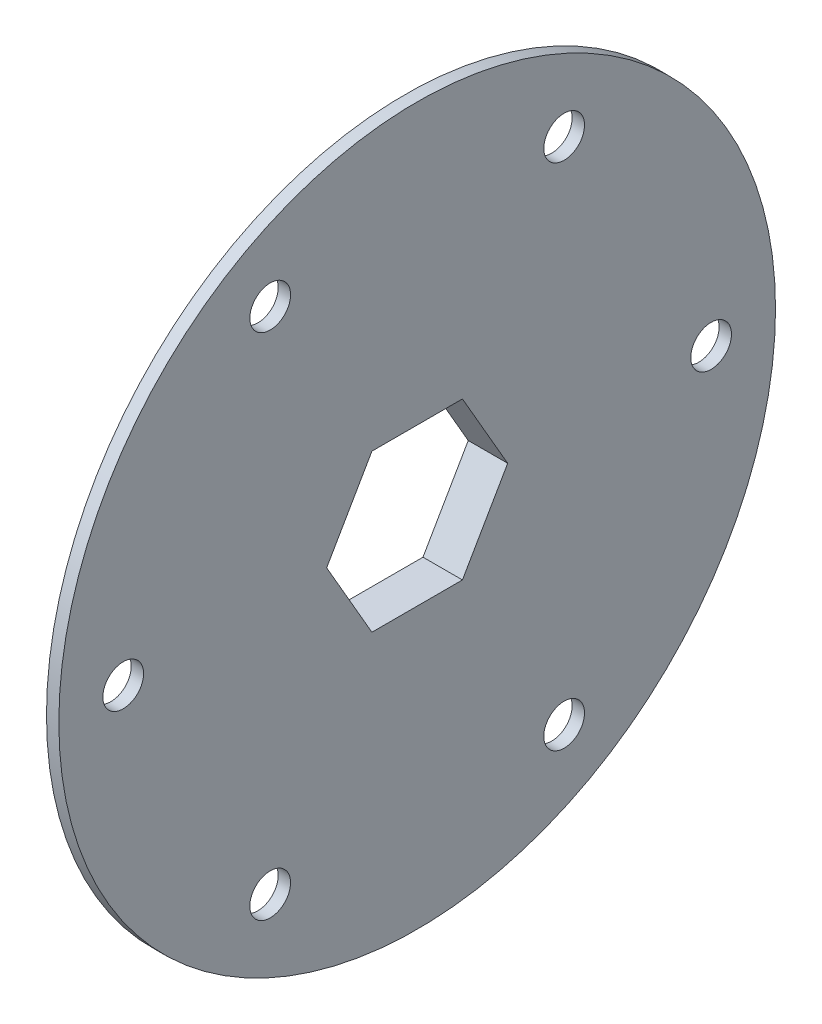
ISO-10303-21;
HEADER;
FILE_DESCRIPTION(('STEP AP214'),'2;1');
FILE_NAME('part.step','',(''),(''),'','','');
FILE_SCHEMA(('AUTOMOTIVE_DESIGN { 1 0 10303 214 1 1 1 1 }'));
ENDSEC;
DATA;
#1=APPLICATION_CONTEXT('core data for automotive mechanical design processes');
#2=APPLICATION_PROTOCOL_DEFINITION('international standard','automotive_design',2000,#1);
#3=PRODUCT_CONTEXT('',#1,'mechanical');
#4=PRODUCT('Part','Part','',(#3));
#5=PRODUCT_RELATED_PRODUCT_CATEGORY('part','',(#4));
#6=PRODUCT_DEFINITION_FORMATION('','',#4);
#7=PRODUCT_DEFINITION_CONTEXT('part definition',#1,'design');
#8=PRODUCT_DEFINITION('design','',#6,#7);
#9=PRODUCT_DEFINITION_SHAPE('','',#8);
#10=(LENGTH_UNIT() NAMED_UNIT(*) SI_UNIT(.MILLI.,.METRE.));
#11=(NAMED_UNIT(*) PLANE_ANGLE_UNIT() SI_UNIT($,.RADIAN.));
#12=(NAMED_UNIT(*) SI_UNIT($,.STERADIAN.) SOLID_ANGLE_UNIT());
#13=UNCERTAINTY_MEASURE_WITH_UNIT(LENGTH_MEASURE(1.E-05),#10,'distance_accuracy_value','');
#14=(GEOMETRIC_REPRESENTATION_CONTEXT(3) GLOBAL_UNCERTAINTY_ASSIGNED_CONTEXT((#13)) GLOBAL_UNIT_ASSIGNED_CONTEXT((#10,
#11,#12)) REPRESENTATION_CONTEXT('',''));
#15=CARTESIAN_POINT('',(0.,0.,0.));
#16=DIRECTION('',(0.,0.,1.));
#17=DIRECTION('',(1.,0.,0.));
#18=AXIS2_PLACEMENT_3D('',#15,#16,#17);
#19=CARTESIAN_POINT('',(1.,3.175,-5.49926131403118));
#20=DIRECTION('',(0.,-0.5,0.866025403784438));
#21=DIRECTION('',(0.,-0.866025403784438,-0.5));
#22=AXIS2_PLACEMENT_3D('',#19,#20,#21);
#23=PLANE('',#22);
#24=DIRECTION('',(-1.,0.,0.));
#25=VECTOR('',#24,1.);
#26=CARTESIAN_POINT('',(1.,6.35,-3.66617420935412));
#27=LINE('',#26,#25);
#28=CARTESIAN_POINT('',(1.,6.35,-3.66617420935412));
#29=VERTEX_POINT('',#28);
#30=CARTESIAN_POINT('',(-2.19543348157795,6.35,-3.66617420935412));
#31=VERTEX_POINT('',#30);
#32=EDGE_CURVE('E82',#29,#31,#27,.T.);
#33=ORIENTED_EDGE('',*,*,#32,.T.);
#34=DIRECTION('',(0.,-0.866025403784438,-0.5));
#35=VECTOR('',#34,1.);
#36=CARTESIAN_POINT('',(-2.19543348157795,3.175,-5.49926131403118));
#37=LINE('',#36,#35);
#38=CARTESIAN_POINT('',(-2.19543348157795,0.,-7.33234841870825));
#39=VERTEX_POINT('',#38);
#40=EDGE_CURVE('E137',#31,#39,#37,.T.);
#41=ORIENTED_EDGE('',*,*,#40,.T.);
#42=DIRECTION('',(-1.,0.,0.));
#43=VECTOR('',#42,1.);
#44=CARTESIAN_POINT('',(1.,0.,-7.33234841870825));
#45=LINE('',#44,#43);
#46=CARTESIAN_POINT('',(1.,0.,-7.33234841870825));
#47=VERTEX_POINT('',#46);
#48=EDGE_CURVE('E75',#47,#39,#45,.T.);
#49=ORIENTED_EDGE('',*,*,#48,.F.);
#50=DIRECTION('',(0.,0.866025403784438,0.5));
#51=VECTOR('',#50,1.);
#52=CARTESIAN_POINT('',(1.,3.175,-5.49926131403118));
#53=LINE('',#52,#51);
#54=EDGE_CURVE('E177',#47,#29,#53,.T.);
#55=ORIENTED_EDGE('',*,*,#54,.T.);
#56=EDGE_LOOP('',(#33,#41,#49,#55));
#57=FACE_BOUND('',#56,.T.);
#58=ADVANCED_FACE('F66',(#57),#23,.T.);
#59=CARTESIAN_POINT('',(1.,-3.175,-5.49926131403118));
#60=DIRECTION('',(0.,0.5,0.866025403784438));
#61=DIRECTION('',(0.,-0.866025403784439,0.5));
#62=AXIS2_PLACEMENT_3D('',#59,#60,#61);
#63=PLANE('',#62);
#64=ORIENTED_EDGE('',*,*,#48,.T.);
#65=DIRECTION('',(0.,-0.866025403784439,0.5));
#66=VECTOR('',#65,1.);
#67=CARTESIAN_POINT('',(-2.19543348157794,-3.175,-5.49926131403119));
#68=LINE('',#67,#66);
#69=CARTESIAN_POINT('',(-2.19543348157794,-6.35,-3.66617420935412));
#70=VERTEX_POINT('',#69);
#71=EDGE_CURVE('E124',#39,#70,#68,.T.);
#72=ORIENTED_EDGE('',*,*,#71,.T.);
#73=DIRECTION('',(-1.,0.,0.));
#74=VECTOR('',#73,1.);
#75=CARTESIAN_POINT('',(1.,-6.35,-3.66617420935412));
#76=LINE('',#75,#74);
#77=CARTESIAN_POINT('',(1.,-6.35,-3.66617420935412));
#78=VERTEX_POINT('',#77);
#79=EDGE_CURVE('E131',#78,#70,#76,.T.);
#80=ORIENTED_EDGE('',*,*,#79,.F.);
#81=DIRECTION('',(0.,0.866025403784439,-0.5));
#82=VECTOR('',#81,1.);
#83=CARTESIAN_POINT('',(1.,-3.175,-5.49926131403118));
#84=LINE('',#83,#82);
#85=EDGE_CURVE('E126',#78,#47,#84,.T.);
#86=ORIENTED_EDGE('',*,*,#85,.T.);
#87=EDGE_LOOP('',(#64,#72,#80,#86));
#88=FACE_BOUND('',#87,.T.);
#89=ADVANCED_FACE('F123',(#88),#63,.T.);
#90=CARTESIAN_POINT('',(1.,-6.35,0.));
#91=DIRECTION('',(0.,1.,0.));
#92=DIRECTION('',(0.,0.,1.));
#93=AXIS2_PLACEMENT_3D('',#90,#91,#92);
#94=PLANE('',#93);
#95=ORIENTED_EDGE('',*,*,#79,.T.);
#96=DIRECTION('',(0.,0.,1.));
#97=VECTOR('',#96,1.);
#98=CARTESIAN_POINT('',(-2.19543348157794,-6.35,0.));
#99=LINE('',#98,#97);
#100=CARTESIAN_POINT('',(-2.19543348157794,-6.35,3.66617420935412));
#101=VERTEX_POINT('',#100);
#102=EDGE_CURVE('E140',#70,#101,#99,.T.);
#103=ORIENTED_EDGE('',*,*,#102,.T.);
#104=DIRECTION('',(-1.,0.,0.));
#105=VECTOR('',#104,1.);
#106=CARTESIAN_POINT('',(1.,-6.35,3.66617420935412));
#107=LINE('',#106,#105);
#108=CARTESIAN_POINT('',(1.,-6.35,3.66617420935412));
#109=VERTEX_POINT('',#108);
#110=EDGE_CURVE('E230',#109,#101,#107,.T.);
#111=ORIENTED_EDGE('',*,*,#110,.F.);
#112=DIRECTION('',(0.,0.,-1.));
#113=VECTOR('',#112,1.);
#114=CARTESIAN_POINT('',(1.,-6.35,0.));
#115=LINE('',#114,#113);
#116=EDGE_CURVE('E182',#109,#78,#115,.T.);
#117=ORIENTED_EDGE('',*,*,#116,.T.);
#118=EDGE_LOOP('',(#95,#103,#111,#117));
#119=FACE_BOUND('',#118,.T.);
#120=ADVANCED_FACE('F235',(#119),#94,.T.);
#121=CARTESIAN_POINT('',(1.,-3.175,5.49926131403118));
#122=DIRECTION('',(0.,0.5,-0.866025403784439));
#123=DIRECTION('',(0.,0.866025403784439,0.5));
#124=AXIS2_PLACEMENT_3D('',#121,#122,#123);
#125=PLANE('',#124);
#126=ORIENTED_EDGE('',*,*,#110,.T.);
#127=DIRECTION('',(0.,0.866025403784439,0.5));
#128=VECTOR('',#127,1.);
#129=CARTESIAN_POINT('',(-2.19543348157794,-3.175,5.49926131403119));
#130=LINE('',#129,#128);
#131=CARTESIAN_POINT('',(-2.19543348157795,0.,7.33234841870825));
#132=VERTEX_POINT('',#131);
#133=EDGE_CURVE('E250',#101,#132,#130,.T.);
#134=ORIENTED_EDGE('',*,*,#133,.T.);
#135=DIRECTION('',(-1.,0.,0.));
#136=VECTOR('',#135,1.);
#137=CARTESIAN_POINT('',(1.,0.,7.33234841870825));
#138=LINE('',#137,#136);
#139=CARTESIAN_POINT('',(1.,0.,7.33234841870825));
#140=VERTEX_POINT('',#139);
#141=EDGE_CURVE('E227',#140,#132,#138,.T.);
#142=ORIENTED_EDGE('',*,*,#141,.F.);
#143=DIRECTION('',(0.,-0.866025403784439,-0.5));
#144=VECTOR('',#143,1.);
#145=CARTESIAN_POINT('',(1.,-3.175,5.49926131403118));
#146=LINE('',#145,#144);
#147=EDGE_CURVE('E186',#140,#109,#146,.T.);
#148=ORIENTED_EDGE('',*,*,#147,.T.);
#149=EDGE_LOOP('',(#126,#134,#142,#148));
#150=FACE_BOUND('',#149,.T.);
#151=ADVANCED_FACE('F257',(#150),#125,.T.);
#152=CARTESIAN_POINT('',(1.,3.175,5.49926131403118));
#153=DIRECTION('',(0.,-0.5,-0.866025403784439));
#154=DIRECTION('',(0.,0.866025403784439,-0.5));
#155=AXIS2_PLACEMENT_3D('',#152,#153,#154);
#156=PLANE('',#155);
#157=ORIENTED_EDGE('',*,*,#141,.T.);
#158=DIRECTION('',(0.,0.866025403784439,-0.5));
#159=VECTOR('',#158,1.);
#160=CARTESIAN_POINT('',(-2.19543348157795,3.175,5.49926131403118));
#161=LINE('',#160,#159);
#162=CARTESIAN_POINT('',(-2.19543348157795,6.35,3.66617420935412));
#163=VERTEX_POINT('',#162);
#164=EDGE_CURVE('E244',#132,#163,#161,.T.);
#165=ORIENTED_EDGE('',*,*,#164,.T.);
#166=DIRECTION('',(-1.,0.,0.));
#167=VECTOR('',#166,1.);
#168=CARTESIAN_POINT('',(1.,6.35,3.66617420935412));
#169=LINE('',#168,#167);
#170=CARTESIAN_POINT('',(1.,6.35,3.66617420935412));
#171=VERTEX_POINT('',#170);
#172=EDGE_CURVE('E90',#171,#163,#169,.T.);
#173=ORIENTED_EDGE('',*,*,#172,.F.);
#174=DIRECTION('',(0.,-0.866025403784439,0.5));
#175=VECTOR('',#174,1.);
#176=CARTESIAN_POINT('',(1.,3.175,5.49926131403118));
#177=LINE('',#176,#175);
#178=EDGE_CURVE('E190',#171,#140,#177,.T.);
#179=ORIENTED_EDGE('',*,*,#178,.T.);
#180=EDGE_LOOP('',(#157,#165,#173,#179));
#181=FACE_BOUND('',#180,.T.);
#182=ADVANCED_FACE('F248',(#181),#156,.T.);
#183=CARTESIAN_POINT('',(1.,0.,0.));
#184=DIRECTION('',(-1.,0.,0.));
#185=DIRECTION('',(0.,0.,1.));
#186=AXIS2_PLACEMENT_3D('',#183,#184,#185);
#187=CYLINDRICAL_SURFACE('',#186,29.03);
#188=CARTESIAN_POINT('',(1.,0.,0.));
#189=DIRECTION('',(1.,0.,0.));
#190=DIRECTION('',(0.,0.,-1.));
#191=AXIS2_PLACEMENT_3D('',#188,#189,#190);
#192=CIRCLE('',#191,29.03);
#193=CARTESIAN_POINT('',(1.,0.,-29.03));
#194=VERTEX_POINT('',#193);
#195=EDGE_CURVE('E173',#194,#194,#192,.T.);
#196=ORIENTED_EDGE('',*,*,#195,.F.);
#197=EDGE_LOOP('',(#196));
#198=FACE_BOUND('',#197,.T.);
#199=CARTESIAN_POINT('',(0.,0.,0.));
#200=DIRECTION('',(1.,0.,0.));
#201=DIRECTION('',(0.,0.,-1.));
#202=AXIS2_PLACEMENT_3D('',#199,#200,#201);
#203=CIRCLE('',#202,29.03);
#204=CARTESIAN_POINT('',(0.,0.,-29.03));
#205=VERTEX_POINT('',#204);
#206=EDGE_CURVE('E153',#205,#205,#203,.T.);
#207=ORIENTED_EDGE('',*,*,#206,.T.);
#208=EDGE_LOOP('',(#207));
#209=FACE_BOUND('',#208,.T.);
#210=ADVANCED_FACE('F264',(#198,#209),#187,.T.);
#211=CARTESIAN_POINT('',(1.,-20.622229927617,-11.90625));
#212=DIRECTION('',(-1.,0.,0.));
#213=DIRECTION('',(0.,0.,1.));
#214=AXIS2_PLACEMENT_3D('',#211,#212,#213);
#215=CYLINDRICAL_SURFACE('',#214,1.65);
#216=CARTESIAN_POINT('',(1.,-20.622229927617,-11.90625));
#217=DIRECTION('',(1.,0.,0.));
#218=DIRECTION('',(0.,0.,-1.));
#219=AXIS2_PLACEMENT_3D('',#216,#217,#218);
#220=CIRCLE('',#219,1.65);
#221=CARTESIAN_POINT('',(1.,-20.622229927617,-13.55625));
#222=VERTEX_POINT('',#221);
#223=EDGE_CURVE('E169',#222,#222,#220,.T.);
#224=ORIENTED_EDGE('',*,*,#223,.T.);
#225=EDGE_LOOP('',(#224));
#226=FACE_BOUND('',#225,.T.);
#227=CARTESIAN_POINT('',(0.,-20.622229927617,-11.90625));
#228=DIRECTION('',(1.,0.,0.));
#229=DIRECTION('',(0.,0.,-1.));
#230=AXIS2_PLACEMENT_3D('',#227,#228,#229);
#231=CIRCLE('',#230,1.65);
#232=CARTESIAN_POINT('',(0.,-20.622229927617,-13.55625));
#233=VERTEX_POINT('',#232);
#234=EDGE_CURVE('E216',#233,#233,#231,.T.);
#235=ORIENTED_EDGE('',*,*,#234,.F.);
#236=EDGE_LOOP('',(#235));
#237=FACE_BOUND('',#236,.T.);
#238=ADVANCED_FACE('F276',(#226,#237),#215,.F.);
#239=CARTESIAN_POINT('',(1.,0.,-23.8125));
#240=DIRECTION('',(-1.,0.,0.));
#241=DIRECTION('',(0.,0.,1.));
#242=AXIS2_PLACEMENT_3D('',#239,#240,#241);
#243=CYLINDRICAL_SURFACE('',#242,1.65);
#244=CARTESIAN_POINT('',(1.,0.,-23.8125));
#245=DIRECTION('',(1.,0.,0.));
#246=DIRECTION('',(0.,0.,-1.));
#247=AXIS2_PLACEMENT_3D('',#244,#245,#246);
#248=CIRCLE('',#247,1.65);
#249=CARTESIAN_POINT('',(1.,0.,-25.4625));
#250=VERTEX_POINT('',#249);
#251=EDGE_CURVE('E165',#250,#250,#248,.T.);
#252=ORIENTED_EDGE('',*,*,#251,.T.);
#253=EDGE_LOOP('',(#252));
#254=FACE_BOUND('',#253,.T.);
#255=CARTESIAN_POINT('',(0.,0.,-23.8125));
#256=DIRECTION('',(1.,0.,0.));
#257=DIRECTION('',(0.,0.,-1.));
#258=AXIS2_PLACEMENT_3D('',#255,#256,#257);
#259=CIRCLE('',#258,1.65);
#260=CARTESIAN_POINT('',(0.,0.,-25.4625));
#261=VERTEX_POINT('',#260);
#262=EDGE_CURVE('E212',#261,#261,#259,.T.);
#263=ORIENTED_EDGE('',*,*,#262,.F.);
#264=EDGE_LOOP('',(#263));
#265=FACE_BOUND('',#264,.T.);
#266=ADVANCED_FACE('F280',(#254,#265),#243,.F.);
#267=CARTESIAN_POINT('',(1.,20.6222299276169,-11.90625));
#268=DIRECTION('',(-1.,0.,0.));
#269=DIRECTION('',(0.,0.,1.));
#270=AXIS2_PLACEMENT_3D('',#267,#268,#269);
#271=CYLINDRICAL_SURFACE('',#270,1.65);
#272=CARTESIAN_POINT('',(1.,20.6222299276169,-11.90625));
#273=DIRECTION('',(1.,0.,0.));
#274=DIRECTION('',(0.,0.,-1.));
#275=AXIS2_PLACEMENT_3D('',#272,#273,#274);
#276=CIRCLE('',#275,1.65);
#277=CARTESIAN_POINT('',(1.,20.6222299276169,-13.55625));
#278=VERTEX_POINT('',#277);
#279=EDGE_CURVE('E161',#278,#278,#276,.T.);
#280=ORIENTED_EDGE('',*,*,#279,.T.);
#281=EDGE_LOOP('',(#280));
#282=FACE_BOUND('',#281,.T.);
#283=CARTESIAN_POINT('',(0.,20.6222299276169,-11.90625));
#284=DIRECTION('',(1.,0.,0.));
#285=DIRECTION('',(0.,0.,-1.));
#286=AXIS2_PLACEMENT_3D('',#283,#284,#285);
#287=CIRCLE('',#286,1.65);
#288=CARTESIAN_POINT('',(0.,20.6222299276169,-13.55625));
#289=VERTEX_POINT('',#288);
#290=EDGE_CURVE('E208',#289,#289,#287,.T.);
#291=ORIENTED_EDGE('',*,*,#290,.F.);
#292=EDGE_LOOP('',(#291));
#293=FACE_BOUND('',#292,.T.);
#294=ADVANCED_FACE('F284',(#282,#293),#271,.F.);
#295=CARTESIAN_POINT('',(1.,20.6222299276169,11.90625));
#296=DIRECTION('',(-1.,0.,0.));
#297=DIRECTION('',(0.,0.,1.));
#298=AXIS2_PLACEMENT_3D('',#295,#296,#297);
#299=CYLINDRICAL_SURFACE('',#298,1.65);
#300=CARTESIAN_POINT('',(1.,20.6222299276169,11.90625));
#301=DIRECTION('',(1.,0.,0.));
#302=DIRECTION('',(0.,0.,-1.));
#303=AXIS2_PLACEMENT_3D('',#300,#301,#302);
#304=CIRCLE('',#303,1.65);
#305=CARTESIAN_POINT('',(1.,20.6222299276169,10.25625));
#306=VERTEX_POINT('',#305);
#307=EDGE_CURVE('E157',#306,#306,#304,.T.);
#308=ORIENTED_EDGE('',*,*,#307,.T.);
#309=EDGE_LOOP('',(#308));
#310=FACE_BOUND('',#309,.T.);
#311=CARTESIAN_POINT('',(0.,20.6222299276169,11.90625));
#312=DIRECTION('',(1.,0.,0.));
#313=DIRECTION('',(0.,0.,-1.));
#314=AXIS2_PLACEMENT_3D('',#311,#312,#313);
#315=CIRCLE('',#314,1.65);
#316=CARTESIAN_POINT('',(0.,20.6222299276169,10.25625));
#317=VERTEX_POINT('',#316);
#318=EDGE_CURVE('E204',#317,#317,#315,.T.);
#319=ORIENTED_EDGE('',*,*,#318,.F.);
#320=EDGE_LOOP('',(#319));
#321=FACE_BOUND('',#320,.T.);
#322=ADVANCED_FACE('F288',(#310,#321),#299,.F.);
#323=CARTESIAN_POINT('',(1.,0.,23.8125));
#324=DIRECTION('',(-1.,0.,0.));
#325=DIRECTION('',(0.,0.,1.));
#326=AXIS2_PLACEMENT_3D('',#323,#324,#325);
#327=CYLINDRICAL_SURFACE('',#326,1.65);
#328=CARTESIAN_POINT('',(1.,0.,23.8125));
#329=DIRECTION('',(1.,0.,0.));
#330=DIRECTION('',(0.,0.,-1.));
#331=AXIS2_PLACEMENT_3D('',#328,#329,#330);
#332=CIRCLE('',#331,1.65);
#333=CARTESIAN_POINT('',(1.,0.,22.1625));
#334=VERTEX_POINT('',#333);
#335=EDGE_CURVE('E152',#334,#334,#332,.T.);
#336=ORIENTED_EDGE('',*,*,#335,.T.);
#337=EDGE_LOOP('',(#336));
#338=FACE_BOUND('',#337,.T.);
#339=CARTESIAN_POINT('',(0.,0.,23.8125));
#340=DIRECTION('',(1.,0.,0.));
#341=DIRECTION('',(0.,0.,-1.));
#342=AXIS2_PLACEMENT_3D('',#339,#340,#341);
#343=CIRCLE('',#342,1.65);
#344=CARTESIAN_POINT('',(0.,0.,22.1625));
#345=VERTEX_POINT('',#344);
#346=EDGE_CURVE('E200',#345,#345,#343,.T.);
#347=ORIENTED_EDGE('',*,*,#346,.F.);
#348=EDGE_LOOP('',(#347));
#349=FACE_BOUND('',#348,.T.);
#350=ADVANCED_FACE('F292',(#338,#349),#327,.F.);
#351=CARTESIAN_POINT('',(1.,-20.622229927617,11.90625));
#352=DIRECTION('',(-1.,0.,0.));
#353=DIRECTION('',(0.,0.,1.));
#354=AXIS2_PLACEMENT_3D('',#351,#352,#353);
#355=CYLINDRICAL_SURFACE('',#354,1.65);
#356=CARTESIAN_POINT('',(1.,-20.622229927617,11.90625));
#357=DIRECTION('',(1.,0.,0.));
#358=DIRECTION('',(0.,0.,-1.));
#359=AXIS2_PLACEMENT_3D('',#356,#357,#358);
#360=CIRCLE('',#359,1.65);
#361=CARTESIAN_POINT('',(1.,-20.622229927617,10.25625));
#362=VERTEX_POINT('',#361);
#363=EDGE_CURVE('E148',#362,#362,#360,.T.);
#364=ORIENTED_EDGE('',*,*,#363,.T.);
#365=EDGE_LOOP('',(#364));
#366=FACE_BOUND('',#365,.T.);
#367=CARTESIAN_POINT('',(0.,-20.622229927617,11.90625));
#368=DIRECTION('',(1.,0.,0.));
#369=DIRECTION('',(0.,0.,-1.));
#370=AXIS2_PLACEMENT_3D('',#367,#368,#369);
#371=CIRCLE('',#370,1.65);
#372=CARTESIAN_POINT('',(0.,-20.622229927617,10.25625));
#373=VERTEX_POINT('',#372);
#374=EDGE_CURVE('E196',#373,#373,#371,.T.);
#375=ORIENTED_EDGE('',*,*,#374,.F.);
#376=EDGE_LOOP('',(#375));
#377=FACE_BOUND('',#376,.T.);
#378=ADVANCED_FACE('F295',(#366,#377),#355,.F.);
#379=CARTESIAN_POINT('',(1.,6.35,0.));
#380=DIRECTION('',(0.,-1.,0.));
#381=DIRECTION('',(0.,0.,-1.));
#382=AXIS2_PLACEMENT_3D('',#379,#380,#381);
#383=PLANE('',#382);
#384=ORIENTED_EDGE('',*,*,#172,.T.);
#385=DIRECTION('',(0.,0.,-1.));
#386=VECTOR('',#385,1.);
#387=CARTESIAN_POINT('',(-2.19543348157795,6.35,0.));
#388=LINE('',#387,#386);
#389=EDGE_CURVE('E242',#163,#31,#388,.T.);
#390=ORIENTED_EDGE('',*,*,#389,.T.);
#391=ORIENTED_EDGE('',*,*,#32,.F.);
#392=DIRECTION('',(0.,0.,1.));
#393=VECTOR('',#392,1.);
#394=CARTESIAN_POINT('',(1.,6.35,0.));
#395=LINE('',#394,#393);
#396=EDGE_CURVE('E193',#29,#171,#395,.T.);
#397=ORIENTED_EDGE('',*,*,#396,.T.);
#398=EDGE_LOOP('',(#384,#390,#391,#397));
#399=FACE_BOUND('',#398,.T.);
#400=ADVANCED_FACE('F241',(#399),#383,.T.);
#401=CARTESIAN_POINT('',(1.,0.,0.));
#402=DIRECTION('',(1.,0.,0.));
#403=DIRECTION('',(0.,0.,-1.));
#404=AXIS2_PLACEMENT_3D('',#401,#402,#403);
#405=PLANE('',#404);
#406=ORIENTED_EDGE('',*,*,#363,.F.);
#407=EDGE_LOOP('',(#406));
#408=FACE_BOUND('',#407,.T.);
#409=ORIENTED_EDGE('',*,*,#335,.F.);
#410=EDGE_LOOP('',(#409));
#411=FACE_BOUND('',#410,.T.);
#412=ORIENTED_EDGE('',*,*,#307,.F.);
#413=EDGE_LOOP('',(#412));
#414=FACE_BOUND('',#413,.T.);
#415=ORIENTED_EDGE('',*,*,#279,.F.);
#416=EDGE_LOOP('',(#415));
#417=FACE_BOUND('',#416,.T.);
#418=ORIENTED_EDGE('',*,*,#251,.F.);
#419=EDGE_LOOP('',(#418));
#420=FACE_BOUND('',#419,.T.);
#421=ORIENTED_EDGE('',*,*,#223,.F.);
#422=EDGE_LOOP('',(#421));
#423=FACE_BOUND('',#422,.T.);
#424=ORIENTED_EDGE('',*,*,#195,.T.);
#425=EDGE_LOOP('',(#424));
#426=FACE_BOUND('',#425,.T.);
#427=ORIENTED_EDGE('',*,*,#54,.F.);
#428=ORIENTED_EDGE('',*,*,#85,.F.);
#429=ORIENTED_EDGE('',*,*,#116,.F.);
#430=ORIENTED_EDGE('',*,*,#147,.F.);
#431=ORIENTED_EDGE('',*,*,#178,.F.);
#432=ORIENTED_EDGE('',*,*,#396,.F.);
#433=EDGE_LOOP('',(#427,#428,#429,#430,#431,#432));
#434=FACE_BOUND('',#433,.T.);
#435=ADVANCED_FACE('F238',(#408,#411,#414,#417,#420,#423,#426,#434),#405,.T.);
#436=CARTESIAN_POINT('',(0.,0.,0.));
#437=DIRECTION('',(1.,0.,0.));
#438=DIRECTION('',(0.,0.,-1.));
#439=AXIS2_PLACEMENT_3D('',#436,#437,#438);
#440=PLANE('',#439);
#441=CARTESIAN_POINT('',(0.,0.,0.));
#442=DIRECTION('',(1.,0.,0.));
#443=DIRECTION('',(0.,0.,-1.));
#444=AXIS2_PLACEMENT_3D('',#441,#442,#443);
#445=CIRCLE('',#444,13.1393727355417);
#446=CARTESIAN_POINT('',(0.,0.,-13.1393727355417));
#447=VERTEX_POINT('',#446);
#448=EDGE_CURVE('E12',#447,#447,#445,.T.);
#449=ORIENTED_EDGE('',*,*,#448,.T.);
#450=EDGE_LOOP('',(#449));
#451=FACE_BOUND('',#450,.T.);
#452=ORIENTED_EDGE('',*,*,#374,.T.);
#453=EDGE_LOOP('',(#452));
#454=FACE_BOUND('',#453,.T.);
#455=ORIENTED_EDGE('',*,*,#346,.T.);
#456=EDGE_LOOP('',(#455));
#457=FACE_BOUND('',#456,.T.);
#458=ORIENTED_EDGE('',*,*,#318,.T.);
#459=EDGE_LOOP('',(#458));
#460=FACE_BOUND('',#459,.T.);
#461=ORIENTED_EDGE('',*,*,#290,.T.);
#462=EDGE_LOOP('',(#461));
#463=FACE_BOUND('',#462,.T.);
#464=ORIENTED_EDGE('',*,*,#262,.T.);
#465=EDGE_LOOP('',(#464));
#466=FACE_BOUND('',#465,.T.);
#467=ORIENTED_EDGE('',*,*,#234,.T.);
#468=EDGE_LOOP('',(#467));
#469=FACE_BOUND('',#468,.T.);
#470=ORIENTED_EDGE('',*,*,#206,.F.);
#471=EDGE_LOOP('',(#470));
#472=FACE_BOUND('',#471,.T.);
#473=ADVANCED_FACE('F307',(#451,#454,#457,#460,#463,#466,#469,#472),#440,.F.);
#474=CARTESIAN_POINT('',(-2.19543348157795,13.4981902193755,-7.76431624326972));
#475=DIRECTION('',(1.,0.,0.));
#476=DIRECTION('',(0.,0.866025403784439,-0.499999999999999));
#477=AXIS2_PLACEMENT_3D('',#474,#475,#476);
#478=PLANE('',#477);
#479=CARTESIAN_POINT('',(-2.19543348157795,0.,0.));
#480=DIRECTION('',(1.,0.,0.));
#481=DIRECTION('',(0.,1.,0.));
#482=AXIS2_PLACEMENT_3D('',#479,#480,#481);
#483=CIRCLE('',#482,9.);
#484=CARTESIAN_POINT('',(-2.19543348157795,9.,0.));
#485=VERTEX_POINT('',#484);
#486=EDGE_CURVE('E147',#485,#485,#483,.F.);
#487=ORIENTED_EDGE('',*,*,#486,.T.);
#488=EDGE_LOOP('',(#487));
#489=FACE_BOUND('',#488,.T.);
#490=ORIENTED_EDGE('',*,*,#40,.F.);
#491=ORIENTED_EDGE('',*,*,#389,.F.);
#492=ORIENTED_EDGE('',*,*,#164,.F.);
#493=ORIENTED_EDGE('',*,*,#133,.F.);
#494=ORIENTED_EDGE('',*,*,#102,.F.);
#495=ORIENTED_EDGE('',*,*,#71,.F.);
#496=EDGE_LOOP('',(#490,#491,#492,#493,#494,#495));
#497=FACE_BOUND('',#496,.T.);
#498=ADVANCED_FACE('F135',(#489,#497),#478,.F.);
#499=CARTESIAN_POINT('',(-5.,0.,0.));
#500=DIRECTION('',(1.,0.,0.));
#501=DIRECTION('',(0.,0.,-1.));
#502=AXIS2_PLACEMENT_3D('',#499,#500,#501);
#503=TOROIDAL_SURFACE('',#502,13.1393727355417,5.);
#504=ORIENTED_EDGE('',*,*,#486,.F.);
#505=EDGE_LOOP('',(#504));
#506=FACE_BOUND('',#505,.T.);
#507=ORIENTED_EDGE('',*,*,#448,.F.);
#508=EDGE_LOOP('',(#507));
#509=FACE_BOUND('',#508,.T.);
#510=ADVANCED_FACE('F68',(#506,#509),#503,.F.);
#511=CLOSED_SHELL('',(#58,#89,#120,#151,#182,#210,#238,#266,#294,#322,#350,#378,#400,#435,#473,
#498,#510));
#512=MANIFOLD_SOLID_BREP('B2',#511);
#513=ADVANCED_BREP_SHAPE_REPRESENTATION('',(#18,#512),#14);
#514=SHAPE_DEFINITION_REPRESENTATION(#9,#513);
ENDSEC;
END-ISO-10303-21;
